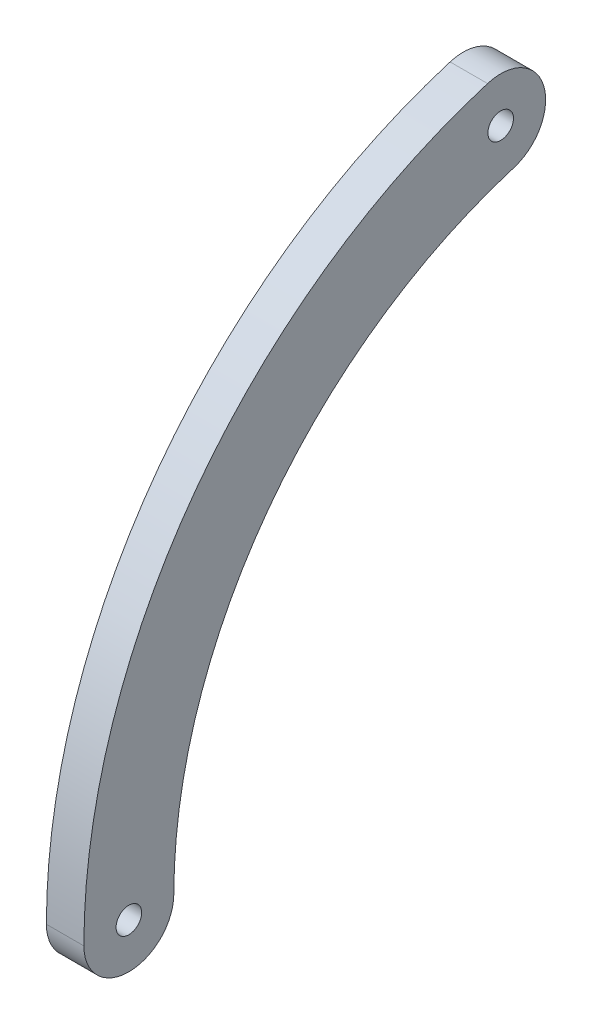
ISO-10303-21;
HEADER;
FILE_DESCRIPTION(('STEP AP214'),'2;1');
FILE_NAME('part.step','',(''),(''),'','','');
FILE_SCHEMA(('AUTOMOTIVE_DESIGN { 1 0 10303 214 1 1 1 1 }'));
ENDSEC;
DATA;
#1=APPLICATION_CONTEXT('core data for automotive mechanical design processes');
#2=APPLICATION_PROTOCOL_DEFINITION('international standard','automotive_design',2000,#1);
#3=PRODUCT_CONTEXT('',#1,'mechanical');
#4=PRODUCT('Part','Part','',(#3));
#5=PRODUCT_RELATED_PRODUCT_CATEGORY('part','',(#4));
#6=PRODUCT_DEFINITION_FORMATION('','',#4);
#7=PRODUCT_DEFINITION_CONTEXT('part definition',#1,'design');
#8=PRODUCT_DEFINITION('design','',#6,#7);
#9=PRODUCT_DEFINITION_SHAPE('','',#8);
#10=(LENGTH_UNIT() NAMED_UNIT(*) SI_UNIT(.MILLI.,.METRE.));
#11=(NAMED_UNIT(*) PLANE_ANGLE_UNIT() SI_UNIT($,.RADIAN.));
#12=(NAMED_UNIT(*) SI_UNIT($,.STERADIAN.) SOLID_ANGLE_UNIT());
#13=UNCERTAINTY_MEASURE_WITH_UNIT(LENGTH_MEASURE(1.E-05),#10,'distance_accuracy_value','');
#14=(GEOMETRIC_REPRESENTATION_CONTEXT(3) GLOBAL_UNCERTAINTY_ASSIGNED_CONTEXT((#13)) GLOBAL_UNIT_ASSIGNED_CONTEXT((#10,
#11,#12)) REPRESENTATION_CONTEXT('',''));
#15=CARTESIAN_POINT('',(0.,0.,0.));
#16=DIRECTION('',(0.,0.,1.));
#17=DIRECTION('',(1.,0.,0.));
#18=AXIS2_PLACEMENT_3D('',#15,#16,#17);
#19=CARTESIAN_POINT('',(3.81,0.,26.67));
#20=DIRECTION('',(1.,0.,0.));
#21=DIRECTION('',(0.,0.,-1.));
#22=AXIS2_PLACEMENT_3D('',#19,#20,#21);
#23=PLANE('',#22);
#24=CARTESIAN_POINT('',(3.81,51.0253857832654,15.542380952381));
#25=DIRECTION('',(1.,0.,0.));
#26=DIRECTION('',(0.,0.,-1.));
#27=AXIS2_PLACEMENT_3D('',#24,#25,#26);
#28=CIRCLE('',#27,1.3);
#29=CARTESIAN_POINT('',(3.81,51.0253857832654,16.842380952381));
#30=VERTEX_POINT('',#29);
#31=EDGE_CURVE('E114',#30,#30,#28,.T.);
#32=ORIENTED_EDGE('',*,*,#31,.F.);
#33=EDGE_LOOP('',(#32));
#34=FACE_BOUND('',#33,.T.);
#35=CARTESIAN_POINT('',(3.81,0.,53.34));
#36=DIRECTION('',(1.,0.,0.));
#37=DIRECTION('',(0.,0.,-1.));
#38=AXIS2_PLACEMENT_3D('',#35,#36,#37);
#39=CIRCLE('',#38,4.572);
#40=CARTESIAN_POINT('',(3.81,0.,57.912));
#41=VERTEX_POINT('',#40);
#42=CARTESIAN_POINT('',(3.81,0.,48.768));
#43=VERTEX_POINT('',#42);
#44=EDGE_CURVE('E94',#41,#43,#39,.T.);
#45=ORIENTED_EDGE('',*,*,#44,.T.);
#46=CARTESIAN_POINT('',(3.81,0.,0.));
#47=DIRECTION('',(-1.,0.,0.));
#48=DIRECTION('',(0.,0.,1.));
#49=AXIS2_PLACEMENT_3D('',#46,#47,#48);
#50=CIRCLE('',#49,48.768);
#51=CARTESIAN_POINT('',(3.81,46.651781287557,14.2101768707483));
#52=VERTEX_POINT('',#51);
#53=EDGE_CURVE('E89',#43,#52,#50,.T.);
#54=ORIENTED_EDGE('',*,*,#53,.T.);
#55=CARTESIAN_POINT('',(3.81,51.0253857832654,15.542380952381));
#56=DIRECTION('',(1.,0.,0.));
#57=DIRECTION('',(0.,0.,-1.));
#58=AXIS2_PLACEMENT_3D('',#55,#56,#57);
#59=CIRCLE('',#58,4.572);
#60=CARTESIAN_POINT('',(3.81,55.3989902789739,16.8745850340136));
#61=VERTEX_POINT('',#60);
#62=EDGE_CURVE('E92',#52,#61,#59,.T.);
#63=ORIENTED_EDGE('',*,*,#62,.T.);
#64=CARTESIAN_POINT('',(3.81,0.,0.));
#65=DIRECTION('',(1.,0.,0.));
#66=DIRECTION('',(0.,0.,1.));
#67=AXIS2_PLACEMENT_3D('',#64,#65,#66);
#68=CIRCLE('',#67,57.912);
#69=EDGE_CURVE('E59',#61,#41,#68,.T.);
#70=ORIENTED_EDGE('',*,*,#69,.T.);
#71=EDGE_LOOP('',(#45,#54,#63,#70));
#72=FACE_BOUND('',#71,.T.);
#73=CARTESIAN_POINT('',(3.81,0.,53.34));
#74=DIRECTION('',(1.,0.,0.));
#75=DIRECTION('',(0.,0.,-1.));
#76=AXIS2_PLACEMENT_3D('',#73,#74,#75);
#77=CIRCLE('',#76,1.3);
#78=CARTESIAN_POINT('',(3.81,0.,54.64));
#79=VERTEX_POINT('',#78);
#80=EDGE_CURVE('E136',#79,#79,#77,.T.);
#81=ORIENTED_EDGE('',*,*,#80,.F.);
#82=EDGE_LOOP('',(#81));
#83=FACE_BOUND('',#82,.T.);
#84=ADVANCED_FACE('F41',(#34,#72,#83),#23,.T.);
#85=CARTESIAN_POINT('',(0.,0.,26.67));
#86=DIRECTION('',(1.,0.,0.));
#87=DIRECTION('',(0.,0.,-1.));
#88=AXIS2_PLACEMENT_3D('',#85,#86,#87);
#89=PLANE('',#88);
#90=CARTESIAN_POINT('',(0.,0.,53.34));
#91=DIRECTION('',(1.,0.,0.));
#92=DIRECTION('',(0.,0.,-1.));
#93=AXIS2_PLACEMENT_3D('',#90,#91,#92);
#94=CIRCLE('',#93,4.572);
#95=CARTESIAN_POINT('',(0.,0.,57.912));
#96=VERTEX_POINT('',#95);
#97=CARTESIAN_POINT('',(0.,0.,48.768));
#98=VERTEX_POINT('',#97);
#99=EDGE_CURVE('E110',#96,#98,#94,.T.);
#100=ORIENTED_EDGE('',*,*,#99,.F.);
#101=CARTESIAN_POINT('',(0.,0.,0.));
#102=DIRECTION('',(1.,0.,0.));
#103=DIRECTION('',(0.,0.,1.));
#104=AXIS2_PLACEMENT_3D('',#101,#102,#103);
#105=CIRCLE('',#104,57.912);
#106=CARTESIAN_POINT('',(0.,55.3989902789739,16.8745850340136));
#107=VERTEX_POINT('',#106);
#108=EDGE_CURVE('E82',#107,#96,#105,.T.);
#109=ORIENTED_EDGE('',*,*,#108,.F.);
#110=CARTESIAN_POINT('',(0.,51.0253857832654,15.542380952381));
#111=DIRECTION('',(1.,0.,0.));
#112=DIRECTION('',(0.,0.,-1.));
#113=AXIS2_PLACEMENT_3D('',#110,#111,#112);
#114=CIRCLE('',#113,4.572);
#115=CARTESIAN_POINT('',(0.,46.651781287557,14.2101768707483));
#116=VERTEX_POINT('',#115);
#117=EDGE_CURVE('E76',#116,#107,#114,.T.);
#118=ORIENTED_EDGE('',*,*,#117,.F.);
#119=CARTESIAN_POINT('',(0.,0.,0.));
#120=DIRECTION('',(-1.,0.,0.));
#121=DIRECTION('',(0.,0.,1.));
#122=AXIS2_PLACEMENT_3D('',#119,#120,#121);
#123=CIRCLE('',#122,48.768);
#124=EDGE_CURVE('E99',#98,#116,#123,.T.);
#125=ORIENTED_EDGE('',*,*,#124,.F.);
#126=EDGE_LOOP('',(#100,#109,#118,#125));
#127=FACE_BOUND('',#126,.T.);
#128=CARTESIAN_POINT('',(0.,51.0253857832654,15.542380952381));
#129=DIRECTION('',(1.,0.,0.));
#130=DIRECTION('',(0.,0.,-1.));
#131=AXIS2_PLACEMENT_3D('',#128,#129,#130);
#132=CIRCLE('',#131,1.3);
#133=CARTESIAN_POINT('',(0.,51.0253857832654,16.842380952381));
#134=VERTEX_POINT('',#133);
#135=EDGE_CURVE('E132',#134,#134,#132,.T.);
#136=ORIENTED_EDGE('',*,*,#135,.T.);
#137=EDGE_LOOP('',(#136));
#138=FACE_BOUND('',#137,.T.);
#139=CARTESIAN_POINT('',(0.,0.,53.34));
#140=DIRECTION('',(1.,0.,0.));
#141=DIRECTION('',(0.,0.,-1.));
#142=AXIS2_PLACEMENT_3D('',#139,#140,#141);
#143=CIRCLE('',#142,1.3);
#144=CARTESIAN_POINT('',(0.,0.,54.64));
#145=VERTEX_POINT('',#144);
#146=EDGE_CURVE('E140',#145,#145,#143,.T.);
#147=ORIENTED_EDGE('',*,*,#146,.T.);
#148=EDGE_LOOP('',(#147));
#149=FACE_BOUND('',#148,.T.);
#150=ADVANCED_FACE('F127',(#127,#138,#149),#89,.F.);
#151=CARTESIAN_POINT('',(3.81,0.,53.34));
#152=DIRECTION('',(-1.,0.,0.));
#153=DIRECTION('',(0.,0.,1.));
#154=AXIS2_PLACEMENT_3D('',#151,#152,#153);
#155=CYLINDRICAL_SURFACE('',#154,4.572);
#156=ORIENTED_EDGE('',*,*,#99,.T.);
#157=DIRECTION('',(-1.,0.,0.));
#158=VECTOR('',#157,1.);
#159=CARTESIAN_POINT('',(3.81,0.,48.768));
#160=LINE('',#159,#158);
#161=EDGE_CURVE('E11',#43,#98,#160,.T.);
#162=ORIENTED_EDGE('',*,*,#161,.F.);
#163=ORIENTED_EDGE('',*,*,#44,.F.);
#164=DIRECTION('',(-1.,0.,0.));
#165=VECTOR('',#164,1.);
#166=CARTESIAN_POINT('',(3.81,0.,57.912));
#167=LINE('',#166,#165);
#168=EDGE_CURVE('E106',#41,#96,#167,.T.);
#169=ORIENTED_EDGE('',*,*,#168,.T.);
#170=EDGE_LOOP('',(#156,#162,#163,#169));
#171=FACE_BOUND('',#170,.T.);
#172=ADVANCED_FACE('F43',(#171),#155,.T.);
#173=CARTESIAN_POINT('',(3.81,0.,0.));
#174=DIRECTION('',(-1.,0.,0.));
#175=DIRECTION('',(0.,0.,1.));
#176=AXIS2_PLACEMENT_3D('',#173,#174,#175);
#177=CYLINDRICAL_SURFACE('',#176,48.768);
#178=ORIENTED_EDGE('',*,*,#124,.T.);
#179=DIRECTION('',(-1.,0.,0.));
#180=VECTOR('',#179,1.);
#181=CARTESIAN_POINT('',(3.81,46.651781287557,14.2101768707483));
#182=LINE('',#181,#180);
#183=EDGE_CURVE('E51',#52,#116,#182,.T.);
#184=ORIENTED_EDGE('',*,*,#183,.F.);
#185=ORIENTED_EDGE('',*,*,#53,.F.);
#186=ORIENTED_EDGE('',*,*,#161,.T.);
#187=EDGE_LOOP('',(#178,#184,#185,#186));
#188=FACE_BOUND('',#187,.T.);
#189=ADVANCED_FACE('F98',(#188),#177,.F.);
#190=CARTESIAN_POINT('',(3.81,51.0253857832654,15.542380952381));
#191=DIRECTION('',(-1.,0.,0.));
#192=DIRECTION('',(0.,0.,1.));
#193=AXIS2_PLACEMENT_3D('',#190,#191,#192);
#194=CYLINDRICAL_SURFACE('',#193,4.572);
#195=ORIENTED_EDGE('',*,*,#117,.T.);
#196=DIRECTION('',(-1.,0.,0.));
#197=VECTOR('',#196,1.);
#198=CARTESIAN_POINT('',(3.81,55.3989902789739,16.8745850340136));
#199=LINE('',#198,#197);
#200=EDGE_CURVE('E101',#61,#107,#199,.T.);
#201=ORIENTED_EDGE('',*,*,#200,.F.);
#202=ORIENTED_EDGE('',*,*,#62,.F.);
#203=ORIENTED_EDGE('',*,*,#183,.T.);
#204=EDGE_LOOP('',(#195,#201,#202,#203));
#205=FACE_BOUND('',#204,.T.);
#206=ADVANCED_FACE('F102',(#205),#194,.T.);
#207=CARTESIAN_POINT('',(3.81,0.,0.));
#208=DIRECTION('',(-1.,0.,0.));
#209=DIRECTION('',(0.,0.,1.));
#210=AXIS2_PLACEMENT_3D('',#207,#208,#209);
#211=CYLINDRICAL_SURFACE('',#210,57.912);
#212=ORIENTED_EDGE('',*,*,#108,.T.);
#213=ORIENTED_EDGE('',*,*,#168,.F.);
#214=ORIENTED_EDGE('',*,*,#69,.F.);
#215=ORIENTED_EDGE('',*,*,#200,.T.);
#216=EDGE_LOOP('',(#212,#213,#214,#215));
#217=FACE_BOUND('',#216,.T.);
#218=ADVANCED_FACE('F124',(#217),#211,.T.);
#219=CARTESIAN_POINT('',(3.81,51.0253857832654,15.542380952381));
#220=DIRECTION('',(-1.,0.,0.));
#221=DIRECTION('',(0.,0.,1.));
#222=AXIS2_PLACEMENT_3D('',#219,#220,#221);
#223=CYLINDRICAL_SURFACE('',#222,1.3);
#224=CARTESIAN_POINT('',(3.81,51.0253857832654,16.842380952381));
#225=CARTESIAN_POINT('',(3.7703125,51.0253857832654,16.842380952381));
#226=CARTESIAN_POINT('',(3.730625,51.0253857832654,16.842380952381));
#227=CARTESIAN_POINT('',(3.65125,51.0253857832654,16.842380952381));
#228=CARTESIAN_POINT('',(3.6115625,51.0253857832654,16.842380952381));
#229=CARTESIAN_POINT('',(3.5321875,51.0253857832654,16.842380952381));
#230=CARTESIAN_POINT('',(3.4925,51.0253857832654,16.842380952381));
#231=CARTESIAN_POINT('',(3.413125,51.0253857832654,16.842380952381));
#232=CARTESIAN_POINT('',(3.3734375,51.0253857832654,16.842380952381));
#233=CARTESIAN_POINT('',(3.2940625,51.0253857832654,16.842380952381));
#234=CARTESIAN_POINT('',(3.254375,51.0253857832654,16.842380952381));
#235=CARTESIAN_POINT('',(3.175,51.0253857832654,16.842380952381));
#236=CARTESIAN_POINT('',(3.1353125,51.0253857832654,16.842380952381));
#237=CARTESIAN_POINT('',(3.0559375,51.0253857832654,16.842380952381));
#238=CARTESIAN_POINT('',(3.01625,51.0253857832654,16.842380952381));
#239=CARTESIAN_POINT('',(2.936875,51.0253857832654,16.842380952381));
#240=CARTESIAN_POINT('',(2.8971875,51.0253857832654,16.842380952381));
#241=CARTESIAN_POINT('',(2.8178125,51.0253857832654,16.842380952381));
#242=CARTESIAN_POINT('',(2.778125,51.0253857832654,16.842380952381));
#243=CARTESIAN_POINT('',(2.69875,51.0253857832654,16.842380952381));
#244=CARTESIAN_POINT('',(2.6590625,51.0253857832654,16.842380952381));
#245=CARTESIAN_POINT('',(2.5796875,51.0253857832654,16.842380952381));
#246=CARTESIAN_POINT('',(2.54,51.0253857832654,16.842380952381));
#247=CARTESIAN_POINT('',(2.460625,51.0253857832654,16.842380952381));
#248=CARTESIAN_POINT('',(2.4209375,51.0253857832654,16.842380952381));
#249=CARTESIAN_POINT('',(2.3415625,51.0253857832654,16.842380952381));
#250=CARTESIAN_POINT('',(2.301875,51.0253857832654,16.842380952381));
#251=CARTESIAN_POINT('',(2.2225,51.0253857832654,16.842380952381));
#252=CARTESIAN_POINT('',(2.1828125,51.0253857832654,16.842380952381));
#253=CARTESIAN_POINT('',(2.1034375,51.0253857832654,16.842380952381));
#254=CARTESIAN_POINT('',(2.06375,51.0253857832654,16.842380952381));
#255=CARTESIAN_POINT('',(1.984375,51.0253857832654,16.842380952381));
#256=CARTESIAN_POINT('',(1.9446875,51.0253857832654,16.842380952381));
#257=CARTESIAN_POINT('',(1.8653125,51.0253857832654,16.842380952381));
#258=CARTESIAN_POINT('',(1.825625,51.0253857832654,16.842380952381));
#259=CARTESIAN_POINT('',(1.74625,51.0253857832654,16.842380952381));
#260=CARTESIAN_POINT('',(1.7065625,51.0253857832654,16.842380952381));
#261=CARTESIAN_POINT('',(1.6271875,51.0253857832654,16.842380952381));
#262=CARTESIAN_POINT('',(1.5875,51.0253857832654,16.842380952381));
#263=CARTESIAN_POINT('',(1.508125,51.0253857832654,16.842380952381));
#264=CARTESIAN_POINT('',(1.4684375,51.0253857832654,16.842380952381));
#265=CARTESIAN_POINT('',(1.3890625,51.0253857832654,16.842380952381));
#266=CARTESIAN_POINT('',(1.349375,51.0253857832654,16.842380952381));
#267=CARTESIAN_POINT('',(1.27,51.0253857832654,16.842380952381));
#268=CARTESIAN_POINT('',(1.2303125,51.0253857832654,16.842380952381));
#269=CARTESIAN_POINT('',(1.1509375,51.0253857832654,16.842380952381));
#270=CARTESIAN_POINT('',(1.11125,51.0253857832654,16.842380952381));
#271=CARTESIAN_POINT('',(1.031875,51.0253857832654,16.842380952381));
#272=CARTESIAN_POINT('',(0.9921875,51.0253857832654,16.842380952381));
#273=CARTESIAN_POINT('',(0.9128125,51.0253857832654,16.842380952381));
#274=CARTESIAN_POINT('',(0.873125,51.0253857832654,16.842380952381));
#275=CARTESIAN_POINT('',(0.79375,51.0253857832654,16.842380952381));
#276=CARTESIAN_POINT('',(0.7540625,51.0253857832654,16.842380952381));
#277=CARTESIAN_POINT('',(0.6746875,51.0253857832654,16.842380952381));
#278=CARTESIAN_POINT('',(0.635,51.0253857832654,16.842380952381));
#279=CARTESIAN_POINT('',(0.555625,51.0253857832654,16.842380952381));
#280=CARTESIAN_POINT('',(0.5159375,51.0253857832654,16.842380952381));
#281=CARTESIAN_POINT('',(0.4365625,51.0253857832654,16.842380952381));
#282=CARTESIAN_POINT('',(0.396875,51.0253857832654,16.842380952381));
#283=CARTESIAN_POINT('',(0.3175,51.0253857832654,16.842380952381));
#284=CARTESIAN_POINT('',(0.2778125,51.0253857832654,16.842380952381));
#285=CARTESIAN_POINT('',(0.1984375,51.0253857832654,16.842380952381));
#286=CARTESIAN_POINT('',(0.15875,51.0253857832654,16.842380952381));
#287=CARTESIAN_POINT('',(0.0793749999999999,51.0253857832654,16.842380952381));
#288=CARTESIAN_POINT('',(0.0396874999999999,51.0253857832654,16.842380952381));
#289=CARTESIAN_POINT('',(0.,51.0253857832654,16.842380952381));
#290=B_SPLINE_CURVE_WITH_KNOTS('',3,(#224,#225,#226,#227,#228,#229,#230,#231,#232,#233,#234,
#235,#236,#237,#238,#239,#240,#241,#242,#243,#244,#245,#246,#247,#248,#249,#250,#251,#252,#253,
#254,#255,#256,#257,#258,#259,#260,#261,#262,#263,#264,#265,#266,#267,#268,#269,#270,#271,#272,
#273,#274,#275,#276,#277,#278,#279,#280,#281,#282,#283,#284,#285,#286,#287,#288,#289),
.UNSPECIFIED.,.F.,.F.,(4,2,2,2,2,2,2,2,2,2,2,2,2,2,2,2,2,2,2,2,2,2,2,2,2,2,2,2,2,2,2,2,4),(0.,
0.1190625,0.238125,0.3571875,0.47625,0.595312499999999,0.714375,0.833437499999999,
0.952499999999999,1.0715625,1.190625,1.3096875,1.42875,1.5478125,1.666875,1.7859375,1.905,
2.0240625,2.143125,2.2621875,2.38125,2.5003125,2.619375,2.7384375,2.8575,2.9765625,3.095625,
3.2146875,3.33375,3.4528125,3.571875,3.6909375,3.81),.UNSPECIFIED.);
#291=EDGE_CURVE('BSEAM159',#30,#134,#290,.T.);
#292=ORIENTED_EDGE('',*,*,#31,.T.);
#293=ORIENTED_EDGE('',*,*,#135,.F.);
#294=ORIENTED_EDGE('',*,*,#291,.T.);
#295=ORIENTED_EDGE('',*,*,#291,.F.);
#296=EDGE_LOOP('',(#292,#294,#293,#295));
#297=FACE_BOUND('',#296,.T.);
#298=ADVANCED_FACE('F159',(#297),#223,.F.);
#299=CARTESIAN_POINT('',(3.81,0.,53.34));
#300=DIRECTION('',(-1.,0.,0.));
#301=DIRECTION('',(0.,0.,1.));
#302=AXIS2_PLACEMENT_3D('',#299,#300,#301);
#303=CYLINDRICAL_SURFACE('',#302,1.3);
#304=CARTESIAN_POINT('',(3.81,0.,54.64));
#305=CARTESIAN_POINT('',(3.7703125,0.,54.64));
#306=CARTESIAN_POINT('',(3.730625,0.,54.64));
#307=CARTESIAN_POINT('',(3.65125,0.,54.64));
#308=CARTESIAN_POINT('',(3.6115625,0.,54.64));
#309=CARTESIAN_POINT('',(3.5321875,0.,54.64));
#310=CARTESIAN_POINT('',(3.4925,0.,54.64));
#311=CARTESIAN_POINT('',(3.413125,0.,54.64));
#312=CARTESIAN_POINT('',(3.3734375,0.,54.64));
#313=CARTESIAN_POINT('',(3.2940625,0.,54.64));
#314=CARTESIAN_POINT('',(3.254375,0.,54.64));
#315=CARTESIAN_POINT('',(3.175,0.,54.64));
#316=CARTESIAN_POINT('',(3.1353125,0.,54.64));
#317=CARTESIAN_POINT('',(3.0559375,0.,54.64));
#318=CARTESIAN_POINT('',(3.01625,0.,54.64));
#319=CARTESIAN_POINT('',(2.936875,0.,54.64));
#320=CARTESIAN_POINT('',(2.8971875,0.,54.64));
#321=CARTESIAN_POINT('',(2.8178125,0.,54.64));
#322=CARTESIAN_POINT('',(2.778125,0.,54.64));
#323=CARTESIAN_POINT('',(2.69875,0.,54.64));
#324=CARTESIAN_POINT('',(2.6590625,0.,54.64));
#325=CARTESIAN_POINT('',(2.5796875,0.,54.64));
#326=CARTESIAN_POINT('',(2.54,0.,54.64));
#327=CARTESIAN_POINT('',(2.460625,0.,54.64));
#328=CARTESIAN_POINT('',(2.4209375,0.,54.64));
#329=CARTESIAN_POINT('',(2.3415625,0.,54.64));
#330=CARTESIAN_POINT('',(2.301875,0.,54.64));
#331=CARTESIAN_POINT('',(2.2225,0.,54.64));
#332=CARTESIAN_POINT('',(2.1828125,0.,54.64));
#333=CARTESIAN_POINT('',(2.1034375,0.,54.64));
#334=CARTESIAN_POINT('',(2.06375,0.,54.64));
#335=CARTESIAN_POINT('',(1.984375,0.,54.64));
#336=CARTESIAN_POINT('',(1.9446875,0.,54.64));
#337=CARTESIAN_POINT('',(1.8653125,0.,54.64));
#338=CARTESIAN_POINT('',(1.825625,0.,54.64));
#339=CARTESIAN_POINT('',(1.74625,0.,54.64));
#340=CARTESIAN_POINT('',(1.7065625,0.,54.64));
#341=CARTESIAN_POINT('',(1.6271875,0.,54.64));
#342=CARTESIAN_POINT('',(1.5875,0.,54.64));
#343=CARTESIAN_POINT('',(1.508125,0.,54.64));
#344=CARTESIAN_POINT('',(1.4684375,0.,54.64));
#345=CARTESIAN_POINT('',(1.3890625,0.,54.64));
#346=CARTESIAN_POINT('',(1.349375,0.,54.64));
#347=CARTESIAN_POINT('',(1.27,0.,54.64));
#348=CARTESIAN_POINT('',(1.2303125,0.,54.64));
#349=CARTESIAN_POINT('',(1.1509375,0.,54.64));
#350=CARTESIAN_POINT('',(1.11125,0.,54.64));
#351=CARTESIAN_POINT('',(1.031875,0.,54.64));
#352=CARTESIAN_POINT('',(0.9921875,0.,54.64));
#353=CARTESIAN_POINT('',(0.9128125,0.,54.64));
#354=CARTESIAN_POINT('',(0.873125,0.,54.64));
#355=CARTESIAN_POINT('',(0.79375,0.,54.64));
#356=CARTESIAN_POINT('',(0.7540625,0.,54.64));
#357=CARTESIAN_POINT('',(0.6746875,0.,54.64));
#358=CARTESIAN_POINT('',(0.635,0.,54.64));
#359=CARTESIAN_POINT('',(0.555625,0.,54.64));
#360=CARTESIAN_POINT('',(0.5159375,0.,54.64));
#361=CARTESIAN_POINT('',(0.4365625,0.,54.64));
#362=CARTESIAN_POINT('',(0.396875,0.,54.64));
#363=CARTESIAN_POINT('',(0.3175,0.,54.64));
#364=CARTESIAN_POINT('',(0.2778125,0.,54.64));
#365=CARTESIAN_POINT('',(0.1984375,0.,54.64));
#366=CARTESIAN_POINT('',(0.15875,0.,54.64));
#367=CARTESIAN_POINT('',(0.0793749999999999,0.,54.64));
#368=CARTESIAN_POINT('',(0.0396874999999999,0.,54.64));
#369=CARTESIAN_POINT('',(0.,0.,54.64));
#370=B_SPLINE_CURVE_WITH_KNOTS('',3,(#304,#305,#306,#307,#308,#309,#310,#311,#312,#313,#314,
#315,#316,#317,#318,#319,#320,#321,#322,#323,#324,#325,#326,#327,#328,#329,#330,#331,#332,#333,
#334,#335,#336,#337,#338,#339,#340,#341,#342,#343,#344,#345,#346,#347,#348,#349,#350,#351,#352,
#353,#354,#355,#356,#357,#358,#359,#360,#361,#362,#363,#364,#365,#366,#367,#368,#369),
.UNSPECIFIED.,.F.,.F.,(4,2,2,2,2,2,2,2,2,2,2,2,2,2,2,2,2,2,2,2,2,2,2,2,2,2,2,2,2,2,2,2,4),(0.,
0.1190625,0.238125,0.3571875,0.47625,0.595312499999999,0.714375,0.833437499999999,
0.952499999999999,1.0715625,1.190625,1.3096875,1.42875,1.5478125,1.666875,1.7859375,1.905,
2.0240625,2.143125,2.2621875,2.38125,2.5003125,2.619375,2.7384375,2.8575,2.9765625,3.095625,
3.2146875,3.33375,3.4528125,3.571875,3.6909375,3.81),.UNSPECIFIED.);
#371=EDGE_CURVE('BSEAM148',#79,#145,#370,.T.);
#372=ORIENTED_EDGE('',*,*,#80,.T.);
#373=ORIENTED_EDGE('',*,*,#146,.F.);
#374=ORIENTED_EDGE('',*,*,#371,.T.);
#375=ORIENTED_EDGE('',*,*,#371,.F.);
#376=EDGE_LOOP('',(#372,#374,#373,#375));
#377=FACE_BOUND('',#376,.T.);
#378=ADVANCED_FACE('F148',(#377),#303,.F.);
#379=CLOSED_SHELL('',(#84,#150,#172,#189,#206,#218,#298,#378));
#380=MANIFOLD_SOLID_BREP('B2',#379);
#381=ADVANCED_BREP_SHAPE_REPRESENTATION('',(#18,#380),#14);
#382=SHAPE_DEFINITION_REPRESENTATION(#9,#381);
ENDSEC;
END-ISO-10303-21;
